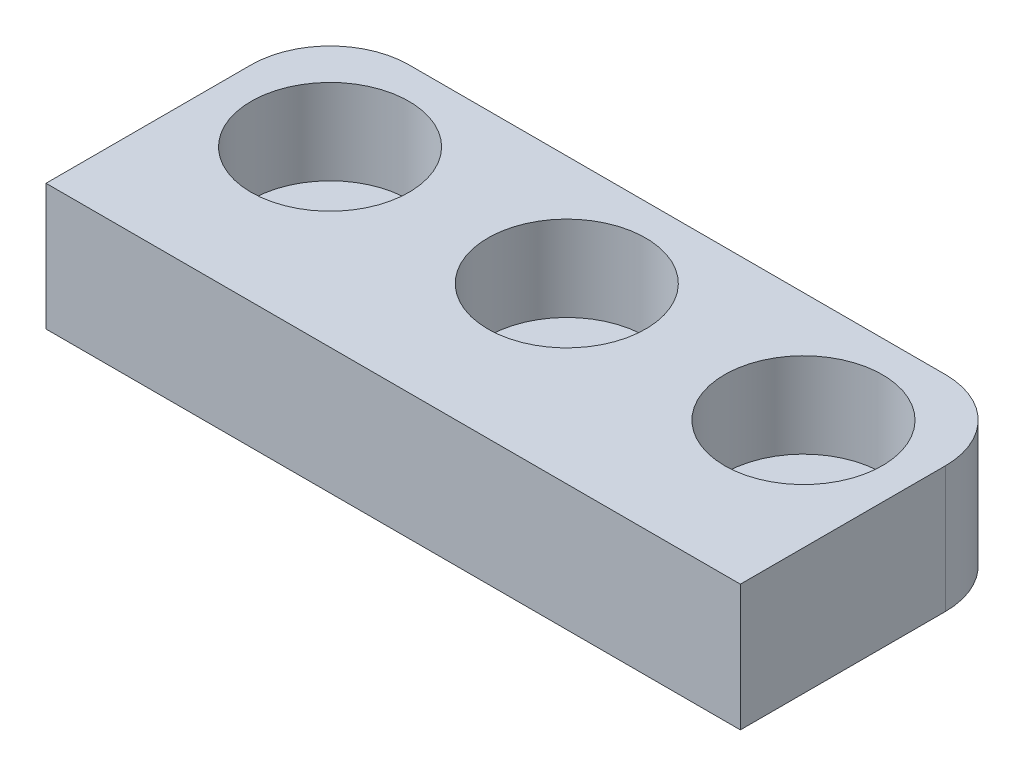
ISO-10303-21;
HEADER;
FILE_DESCRIPTION(('STEP AP214'),'2;1');
FILE_NAME('part.step','',(''),(''),'','','');
FILE_SCHEMA(('AUTOMOTIVE_DESIGN { 1 0 10303 214 1 1 1 1 }'));
ENDSEC;
DATA;
#1=APPLICATION_CONTEXT('core data for automotive mechanical design processes');
#2=APPLICATION_PROTOCOL_DEFINITION('international standard','automotive_design',2000,#1);
#3=PRODUCT_CONTEXT('',#1,'mechanical');
#4=PRODUCT('Part','Part','',(#3));
#5=PRODUCT_RELATED_PRODUCT_CATEGORY('part','',(#4));
#6=PRODUCT_DEFINITION_FORMATION('','',#4);
#7=PRODUCT_DEFINITION_CONTEXT('part definition',#1,'design');
#8=PRODUCT_DEFINITION('design','',#6,#7);
#9=PRODUCT_DEFINITION_SHAPE('','',#8);
#10=(LENGTH_UNIT() NAMED_UNIT(*) SI_UNIT(.MILLI.,.METRE.));
#11=(NAMED_UNIT(*) PLANE_ANGLE_UNIT() SI_UNIT($,.RADIAN.));
#12=(NAMED_UNIT(*) SI_UNIT($,.STERADIAN.) SOLID_ANGLE_UNIT());
#13=UNCERTAINTY_MEASURE_WITH_UNIT(LENGTH_MEASURE(1.E-05),#10,'distance_accuracy_value','');
#14=(GEOMETRIC_REPRESENTATION_CONTEXT(3) GLOBAL_UNCERTAINTY_ASSIGNED_CONTEXT((#13)) GLOBAL_UNIT_ASSIGNED_CONTEXT((#10,
#11,#12)) REPRESENTATION_CONTEXT('',''));
#15=CARTESIAN_POINT('',(0.,0.,0.));
#16=DIRECTION('',(0.,0.,1.));
#17=DIRECTION('',(1.,0.,0.));
#18=AXIS2_PLACEMENT_3D('',#15,#16,#17);
#19=CARTESIAN_POINT('',(22.,-8.,9.));
#20=DIRECTION('',(1.,0.,0.));
#21=DIRECTION('',(0.,0.,-1.));
#22=AXIS2_PLACEMENT_3D('',#19,#20,#21);
#23=PLANE('',#22);
#24=DIRECTION('',(0.,0.,-1.));
#25=VECTOR('',#24,1.);
#26=CARTESIAN_POINT('',(22.,-8.,9.));
#27=LINE('',#26,#25);
#28=CARTESIAN_POINT('',(22.,-8.,9.));
#29=VERTEX_POINT('',#28);
#30=CARTESIAN_POINT('',(22.,-8.,-4.));
#31=VERTEX_POINT('',#30);
#32=EDGE_CURVE('E110',#29,#31,#27,.T.);
#33=ORIENTED_EDGE('',*,*,#32,.T.);
#34=DIRECTION('',(0.,1.,0.));
#35=VECTOR('',#34,1.);
#36=CARTESIAN_POINT('',(22.,-8.,-4.));
#37=LINE('',#36,#35);
#38=CARTESIAN_POINT('',(22.,0.,-4.));
#39=VERTEX_POINT('',#38);
#40=EDGE_CURVE('E124',#31,#39,#37,.T.);
#41=ORIENTED_EDGE('',*,*,#40,.T.);
#42=DIRECTION('',(0.,0.,-1.));
#43=VECTOR('',#42,1.);
#44=CARTESIAN_POINT('',(22.,0.,9.));
#45=LINE('',#44,#43);
#46=CARTESIAN_POINT('',(22.,0.,9.));
#47=VERTEX_POINT('',#46);
#48=EDGE_CURVE('E114',#47,#39,#45,.T.);
#49=ORIENTED_EDGE('',*,*,#48,.F.);
#50=DIRECTION('',(0.,1.,0.));
#51=VECTOR('',#50,1.);
#52=CARTESIAN_POINT('',(22.,-8.,9.));
#53=LINE('',#52,#51);
#54=EDGE_CURVE('E105',#29,#47,#53,.T.);
#55=ORIENTED_EDGE('',*,*,#54,.F.);
#56=EDGE_LOOP('',(#33,#41,#49,#55));
#57=FACE_BOUND('',#56,.T.);
#58=ADVANCED_FACE('F40',(#57),#23,.T.);
#59=CARTESIAN_POINT('',(-22.,-8.,9.));
#60=DIRECTION('',(0.,0.,1.));
#61=DIRECTION('',(1.,0.,0.));
#62=AXIS2_PLACEMENT_3D('',#59,#60,#61);
#63=PLANE('',#62);
#64=DIRECTION('',(1.,0.,0.));
#65=VECTOR('',#64,1.);
#66=CARTESIAN_POINT('',(-22.,0.,9.));
#67=LINE('',#66,#65);
#68=CARTESIAN_POINT('',(-22.,0.,9.));
#69=VERTEX_POINT('',#68);
#70=EDGE_CURVE('E104',#69,#47,#67,.T.);
#71=ORIENTED_EDGE('',*,*,#70,.F.);
#72=DIRECTION('',(0.,1.,0.));
#73=VECTOR('',#72,1.);
#74=CARTESIAN_POINT('',(-22.,-8.,9.));
#75=LINE('',#74,#73);
#76=CARTESIAN_POINT('',(-22.,-8.,9.));
#77=VERTEX_POINT('',#76);
#78=EDGE_CURVE('E94',#77,#69,#75,.T.);
#79=ORIENTED_EDGE('',*,*,#78,.F.);
#80=DIRECTION('',(1.,0.,0.));
#81=VECTOR('',#80,1.);
#82=CARTESIAN_POINT('',(-22.,-8.,9.));
#83=LINE('',#82,#81);
#84=EDGE_CURVE('E97',#77,#29,#83,.T.);
#85=ORIENTED_EDGE('',*,*,#84,.T.);
#86=ORIENTED_EDGE('',*,*,#54,.T.);
#87=EDGE_LOOP('',(#71,#79,#85,#86));
#88=FACE_BOUND('',#87,.T.);
#89=ADVANCED_FACE('F102',(#88),#63,.T.);
#90=CARTESIAN_POINT('',(-22.,-8.,9.));
#91=DIRECTION('',(-1.,0.,0.));
#92=DIRECTION('',(0.,0.,1.));
#93=AXIS2_PLACEMENT_3D('',#90,#91,#92);
#94=PLANE('',#93);
#95=DIRECTION('',(0.,0.,1.));
#96=VECTOR('',#95,1.);
#97=CARTESIAN_POINT('',(-22.,0.,9.));
#98=LINE('',#97,#96);
#99=CARTESIAN_POINT('',(-22.,0.,-4.));
#100=VERTEX_POINT('',#99);
#101=EDGE_CURVE('E121',#100,#69,#98,.T.);
#102=ORIENTED_EDGE('',*,*,#101,.F.);
#103=DIRECTION('',(0.,1.,0.));
#104=VECTOR('',#103,1.);
#105=CARTESIAN_POINT('',(-22.,-8.,-4.));
#106=LINE('',#105,#104);
#107=CARTESIAN_POINT('',(-22.,-8.,-4.));
#108=VERTEX_POINT('',#107);
#109=EDGE_CURVE('E11',#100,#108,#106,.F.);
#110=ORIENTED_EDGE('',*,*,#109,.T.);
#111=DIRECTION('',(0.,0.,1.));
#112=VECTOR('',#111,1.);
#113=CARTESIAN_POINT('',(-22.,-8.,9.));
#114=LINE('',#113,#112);
#115=EDGE_CURVE('E91',#108,#77,#114,.T.);
#116=ORIENTED_EDGE('',*,*,#115,.T.);
#117=ORIENTED_EDGE('',*,*,#78,.T.);
#118=EDGE_LOOP('',(#102,#110,#116,#117));
#119=FACE_BOUND('',#118,.T.);
#120=ADVANCED_FACE('F93',(#119),#94,.T.);
#121=CARTESIAN_POINT('',(-22.,-8.,-9.));
#122=DIRECTION('',(0.,0.,-1.));
#123=DIRECTION('',(-1.,0.,0.));
#124=AXIS2_PLACEMENT_3D('',#121,#122,#123);
#125=PLANE('',#124);
#126=DIRECTION('',(-1.,0.,0.));
#127=VECTOR('',#126,1.);
#128=CARTESIAN_POINT('',(-22.,0.,-9.));
#129=LINE('',#128,#127);
#130=CARTESIAN_POINT('',(17.,0.,-9.));
#131=VERTEX_POINT('',#130);
#132=CARTESIAN_POINT('',(-17.,0.,-9.));
#133=VERTEX_POINT('',#132);
#134=EDGE_CURVE('E117',#131,#133,#129,.T.);
#135=ORIENTED_EDGE('',*,*,#134,.F.);
#136=DIRECTION('',(0.,1.,0.));
#137=VECTOR('',#136,1.);
#138=CARTESIAN_POINT('',(17.,-8.,-9.));
#139=LINE('',#138,#137);
#140=CARTESIAN_POINT('',(17.,-8.,-9.));
#141=VERTEX_POINT('',#140);
#142=EDGE_CURVE('E135',#131,#141,#139,.F.);
#143=ORIENTED_EDGE('',*,*,#142,.T.);
#144=DIRECTION('',(-1.,0.,0.));
#145=VECTOR('',#144,1.);
#146=CARTESIAN_POINT('',(-22.,-8.,-9.));
#147=LINE('',#146,#145);
#148=CARTESIAN_POINT('',(-17.,-8.,-9.));
#149=VERTEX_POINT('',#148);
#150=EDGE_CURVE('E98',#141,#149,#147,.T.);
#151=ORIENTED_EDGE('',*,*,#150,.T.);
#152=DIRECTION('',(0.,1.,0.));
#153=VECTOR('',#152,1.);
#154=CARTESIAN_POINT('',(-17.,-8.,-9.));
#155=LINE('',#154,#153);
#156=EDGE_CURVE('E132',#149,#133,#155,.T.);
#157=ORIENTED_EDGE('',*,*,#156,.T.);
#158=EDGE_LOOP('',(#135,#143,#151,#157));
#159=FACE_BOUND('',#158,.T.);
#160=ADVANCED_FACE('F149',(#159),#125,.T.);
#161=CARTESIAN_POINT('',(0.,-8.,0.));
#162=DIRECTION('',(0.,-1.,0.));
#163=DIRECTION('',(0.,0.,-1.));
#164=AXIS2_PLACEMENT_3D('',#161,#162,#163);
#165=PLANE('',#164);
#166=CARTESIAN_POINT('',(-15.,-8.,-2.));
#167=DIRECTION('',(0.,1.,0.));
#168=DIRECTION('',(0.,0.,1.));
#169=AXIS2_PLACEMENT_3D('',#166,#167,#168);
#170=CIRCLE('',#169,2.65);
#171=CARTESIAN_POINT('',(-15.,-8.,0.65));
#172=VERTEX_POINT('',#171);
#173=EDGE_CURVE('E223',#172,#172,#170,.T.);
#174=ORIENTED_EDGE('',*,*,#173,.T.);
#175=EDGE_LOOP('',(#174));
#176=FACE_BOUND('',#175,.T.);
#177=CARTESIAN_POINT('',(0.,-8.,-2.));
#178=DIRECTION('',(0.,1.,0.));
#179=DIRECTION('',(0.,0.,1.));
#180=AXIS2_PLACEMENT_3D('',#177,#178,#179);
#181=CIRCLE('',#180,2.65);
#182=CARTESIAN_POINT('',(0.,-8.,0.65));
#183=VERTEX_POINT('',#182);
#184=EDGE_CURVE('E235',#183,#183,#181,.T.);
#185=ORIENTED_EDGE('',*,*,#184,.T.);
#186=EDGE_LOOP('',(#185));
#187=FACE_BOUND('',#186,.T.);
#188=CARTESIAN_POINT('',(15.,-8.,-2.));
#189=DIRECTION('',(0.,1.,0.));
#190=DIRECTION('',(0.,0.,1.));
#191=AXIS2_PLACEMENT_3D('',#188,#189,#190);
#192=CIRCLE('',#191,2.65);
#193=CARTESIAN_POINT('',(15.,-8.,0.649999999999997));
#194=VERTEX_POINT('',#193);
#195=EDGE_CURVE('E118',#194,#194,#192,.T.);
#196=ORIENTED_EDGE('',*,*,#195,.T.);
#197=EDGE_LOOP('',(#196));
#198=FACE_BOUND('',#197,.T.);
#199=ORIENTED_EDGE('',*,*,#150,.F.);
#200=CARTESIAN_POINT('',(17.,-8.,-4.));
#201=DIRECTION('',(0.,-1.,0.));
#202=DIRECTION('',(0.,0.,-1.));
#203=AXIS2_PLACEMENT_3D('',#200,#201,#202);
#204=CIRCLE('',#203,5.);
#205=EDGE_CURVE('E48',#141,#31,#204,.T.);
#206=ORIENTED_EDGE('',*,*,#205,.T.);
#207=ORIENTED_EDGE('',*,*,#32,.F.);
#208=ORIENTED_EDGE('',*,*,#84,.F.);
#209=ORIENTED_EDGE('',*,*,#115,.F.);
#210=CARTESIAN_POINT('',(-17.,-8.,-4.));
#211=DIRECTION('',(0.,-1.,0.));
#212=DIRECTION('',(0.,0.,-1.));
#213=AXIS2_PLACEMENT_3D('',#210,#211,#212);
#214=CIRCLE('',#213,5.);
#215=EDGE_CURVE('E60',#108,#149,#214,.T.);
#216=ORIENTED_EDGE('',*,*,#215,.T.);
#217=EDGE_LOOP('',(#199,#206,#207,#208,#209,#216));
#218=FACE_BOUND('',#217,.T.);
#219=ADVANCED_FACE('F108',(#176,#187,#198,#218),#165,.T.);
#220=CARTESIAN_POINT('',(0.,0.,0.));
#221=DIRECTION('',(0.,-1.,0.));
#222=DIRECTION('',(0.,0.,-1.));
#223=AXIS2_PLACEMENT_3D('',#220,#221,#222);
#224=PLANE('',#223);
#225=CARTESIAN_POINT('',(-15.,0.,-2.));
#226=DIRECTION('',(0.,1.,0.));
#227=DIRECTION('',(0.,0.,1.));
#228=AXIS2_PLACEMENT_3D('',#225,#226,#227);
#229=CIRCLE('',#228,5.);
#230=CARTESIAN_POINT('',(-15.,0.,3.));
#231=VERTEX_POINT('',#230);
#232=EDGE_CURVE('E216',#231,#231,#229,.T.);
#233=ORIENTED_EDGE('',*,*,#232,.F.);
#234=EDGE_LOOP('',(#233));
#235=FACE_BOUND('',#234,.T.);
#236=CARTESIAN_POINT('',(0.,0.,-2.));
#237=DIRECTION('',(0.,1.,0.));
#238=DIRECTION('',(0.,0.,1.));
#239=AXIS2_PLACEMENT_3D('',#236,#237,#238);
#240=CIRCLE('',#239,5.);
#241=CARTESIAN_POINT('',(0.,0.,3.));
#242=VERTEX_POINT('',#241);
#243=EDGE_CURVE('E226',#242,#242,#240,.T.);
#244=ORIENTED_EDGE('',*,*,#243,.F.);
#245=EDGE_LOOP('',(#244));
#246=FACE_BOUND('',#245,.T.);
#247=CARTESIAN_POINT('',(15.,0.,-2.));
#248=DIRECTION('',(0.,1.,0.));
#249=DIRECTION('',(0.,0.,1.));
#250=AXIS2_PLACEMENT_3D('',#247,#248,#249);
#251=CIRCLE('',#250,5.);
#252=CARTESIAN_POINT('',(15.,0.,3.));
#253=VERTEX_POINT('',#252);
#254=EDGE_CURVE('E238',#253,#253,#251,.T.);
#255=ORIENTED_EDGE('',*,*,#254,.F.);
#256=EDGE_LOOP('',(#255));
#257=FACE_BOUND('',#256,.T.);
#258=ORIENTED_EDGE('',*,*,#48,.T.);
#259=CARTESIAN_POINT('',(17.,0.,-4.));
#260=DIRECTION('',(0.,-1.,0.));
#261=DIRECTION('',(0.,0.,-1.));
#262=AXIS2_PLACEMENT_3D('',#259,#260,#261);
#263=CIRCLE('',#262,5.);
#264=EDGE_CURVE('E130',#39,#131,#263,.F.);
#265=ORIENTED_EDGE('',*,*,#264,.T.);
#266=ORIENTED_EDGE('',*,*,#134,.T.);
#267=CARTESIAN_POINT('',(-17.,0.,-4.));
#268=DIRECTION('',(0.,-1.,0.));
#269=DIRECTION('',(0.,0.,-1.));
#270=AXIS2_PLACEMENT_3D('',#267,#268,#269);
#271=CIRCLE('',#270,5.);
#272=EDGE_CURVE('E128',#133,#100,#271,.F.);
#273=ORIENTED_EDGE('',*,*,#272,.T.);
#274=ORIENTED_EDGE('',*,*,#101,.T.);
#275=ORIENTED_EDGE('',*,*,#70,.T.);
#276=EDGE_LOOP('',(#258,#265,#266,#273,#274,#275));
#277=FACE_BOUND('',#276,.T.);
#278=ADVANCED_FACE('F147',(#235,#246,#257,#277),#224,.F.);
#279=CARTESIAN_POINT('',(15.,0.,-2.));
#280=DIRECTION('',(0.,1.,0.));
#281=DIRECTION('',(0.,0.,1.));
#282=AXIS2_PLACEMENT_3D('',#279,#280,#281);
#283=CYLINDRICAL_SURFACE('',#282,2.65);
#284=ORIENTED_EDGE('',*,*,#195,.F.);
#285=EDGE_LOOP('',(#284));
#286=FACE_BOUND('',#285,.T.);
#287=CARTESIAN_POINT('',(15.,-5.4,-2.));
#288=DIRECTION('',(0.,1.,0.));
#289=DIRECTION('',(0.,0.,1.));
#290=AXIS2_PLACEMENT_3D('',#287,#288,#289);
#291=CIRCLE('',#290,2.65);
#292=CARTESIAN_POINT('',(15.,-5.4,0.649999999999997));
#293=VERTEX_POINT('',#292);
#294=EDGE_CURVE('E244',#293,#293,#291,.T.);
#295=ORIENTED_EDGE('',*,*,#294,.T.);
#296=EDGE_LOOP('',(#295));
#297=FACE_BOUND('',#296,.T.);
#298=ADVANCED_FACE('F171',(#286,#297),#283,.F.);
#299=CARTESIAN_POINT('',(17.65,-5.4,-2.));
#300=DIRECTION('',(0.,-1.,0.));
#301=DIRECTION('',(0.,0.,-1.));
#302=AXIS2_PLACEMENT_3D('',#299,#300,#301);
#303=PLANE('',#302);
#304=ORIENTED_EDGE('',*,*,#294,.F.);
#305=EDGE_LOOP('',(#304));
#306=FACE_BOUND('',#305,.T.);
#307=CARTESIAN_POINT('',(15.,-5.4,-2.));
#308=DIRECTION('',(0.,1.,0.));
#309=DIRECTION('',(0.,0.,1.));
#310=AXIS2_PLACEMENT_3D('',#307,#308,#309);
#311=CIRCLE('',#310,5.);
#312=CARTESIAN_POINT('',(15.,-5.4,2.99999999999999));
#313=VERTEX_POINT('',#312);
#314=EDGE_CURVE('E241',#313,#313,#311,.T.);
#315=ORIENTED_EDGE('',*,*,#314,.T.);
#316=EDGE_LOOP('',(#315));
#317=FACE_BOUND('',#316,.T.);
#318=ADVANCED_FACE('F178',(#306,#317),#303,.F.);
#319=CARTESIAN_POINT('',(15.,0.,-2.));
#320=DIRECTION('',(0.,1.,0.));
#321=DIRECTION('',(0.,0.,1.));
#322=AXIS2_PLACEMENT_3D('',#319,#320,#321);
#323=CYLINDRICAL_SURFACE('',#322,5.);
#324=ORIENTED_EDGE('',*,*,#314,.F.);
#325=EDGE_LOOP('',(#324));
#326=FACE_BOUND('',#325,.T.);
#327=ORIENTED_EDGE('',*,*,#254,.T.);
#328=EDGE_LOOP('',(#327));
#329=FACE_BOUND('',#328,.T.);
#330=ADVANCED_FACE('F182',(#326,#329),#323,.F.);
#331=CARTESIAN_POINT('',(0.,0.,-2.));
#332=DIRECTION('',(0.,1.,0.));
#333=DIRECTION('',(0.,0.,1.));
#334=AXIS2_PLACEMENT_3D('',#331,#332,#333);
#335=CYLINDRICAL_SURFACE('',#334,2.65);
#336=ORIENTED_EDGE('',*,*,#184,.F.);
#337=EDGE_LOOP('',(#336));
#338=FACE_BOUND('',#337,.T.);
#339=CARTESIAN_POINT('',(0.,-5.4,-2.));
#340=DIRECTION('',(0.,1.,0.));
#341=DIRECTION('',(0.,0.,1.));
#342=AXIS2_PLACEMENT_3D('',#339,#340,#341);
#343=CIRCLE('',#342,2.65);
#344=CARTESIAN_POINT('',(0.,-5.4,0.650000000000001));
#345=VERTEX_POINT('',#344);
#346=EDGE_CURVE('E232',#345,#345,#343,.T.);
#347=ORIENTED_EDGE('',*,*,#346,.T.);
#348=EDGE_LOOP('',(#347));
#349=FACE_BOUND('',#348,.T.);
#350=ADVANCED_FACE('F186',(#338,#349),#335,.F.);
#351=CARTESIAN_POINT('',(2.65,-5.4,-2.));
#352=DIRECTION('',(0.,-1.,0.));
#353=DIRECTION('',(0.,0.,-1.));
#354=AXIS2_PLACEMENT_3D('',#351,#352,#353);
#355=PLANE('',#354);
#356=ORIENTED_EDGE('',*,*,#346,.F.);
#357=EDGE_LOOP('',(#356));
#358=FACE_BOUND('',#357,.T.);
#359=CARTESIAN_POINT('',(0.,-5.4,-2.));
#360=DIRECTION('',(0.,1.,0.));
#361=DIRECTION('',(0.,0.,1.));
#362=AXIS2_PLACEMENT_3D('',#359,#360,#361);
#363=CIRCLE('',#362,5.);
#364=CARTESIAN_POINT('',(0.,-5.4,3.));
#365=VERTEX_POINT('',#364);
#366=EDGE_CURVE('E229',#365,#365,#363,.T.);
#367=ORIENTED_EDGE('',*,*,#366,.T.);
#368=EDGE_LOOP('',(#367));
#369=FACE_BOUND('',#368,.T.);
#370=ADVANCED_FACE('F190',(#358,#369),#355,.F.);
#371=CARTESIAN_POINT('',(0.,0.,-2.));
#372=DIRECTION('',(0.,1.,0.));
#373=DIRECTION('',(0.,0.,1.));
#374=AXIS2_PLACEMENT_3D('',#371,#372,#373);
#375=CYLINDRICAL_SURFACE('',#374,5.);
#376=ORIENTED_EDGE('',*,*,#366,.F.);
#377=EDGE_LOOP('',(#376));
#378=FACE_BOUND('',#377,.T.);
#379=ORIENTED_EDGE('',*,*,#243,.T.);
#380=EDGE_LOOP('',(#379));
#381=FACE_BOUND('',#380,.T.);
#382=ADVANCED_FACE('F194',(#378,#381),#375,.F.);
#383=CARTESIAN_POINT('',(-15.,0.,-2.));
#384=DIRECTION('',(0.,1.,0.));
#385=DIRECTION('',(0.,0.,1.));
#386=AXIS2_PLACEMENT_3D('',#383,#384,#385);
#387=CYLINDRICAL_SURFACE('',#386,2.65);
#388=ORIENTED_EDGE('',*,*,#173,.F.);
#389=EDGE_LOOP('',(#388));
#390=FACE_BOUND('',#389,.T.);
#391=CARTESIAN_POINT('',(-15.,-5.4,-2.));
#392=DIRECTION('',(0.,1.,0.));
#393=DIRECTION('',(0.,0.,1.));
#394=AXIS2_PLACEMENT_3D('',#391,#392,#393);
#395=CIRCLE('',#394,2.65);
#396=CARTESIAN_POINT('',(-15.,-5.4,0.65));
#397=VERTEX_POINT('',#396);
#398=EDGE_CURVE('E218',#397,#397,#395,.T.);
#399=ORIENTED_EDGE('',*,*,#398,.T.);
#400=EDGE_LOOP('',(#399));
#401=FACE_BOUND('',#400,.T.);
#402=ADVANCED_FACE('F198',(#390,#401),#387,.F.);
#403=CARTESIAN_POINT('',(-12.35,-5.4,-2.));
#404=DIRECTION('',(0.,-1.,0.));
#405=DIRECTION('',(0.,0.,-1.));
#406=AXIS2_PLACEMENT_3D('',#403,#404,#405);
#407=PLANE('',#406);
#408=ORIENTED_EDGE('',*,*,#398,.F.);
#409=EDGE_LOOP('',(#408));
#410=FACE_BOUND('',#409,.T.);
#411=CARTESIAN_POINT('',(-15.,-5.4,-2.));
#412=DIRECTION('',(0.,1.,0.));
#413=DIRECTION('',(0.,0.,1.));
#414=AXIS2_PLACEMENT_3D('',#411,#412,#413);
#415=CIRCLE('',#414,5.);
#416=CARTESIAN_POINT('',(-15.,-5.4,3.));
#417=VERTEX_POINT('',#416);
#418=EDGE_CURVE('E213',#417,#417,#415,.T.);
#419=ORIENTED_EDGE('',*,*,#418,.T.);
#420=EDGE_LOOP('',(#419));
#421=FACE_BOUND('',#420,.T.);
#422=ADVANCED_FACE('F202',(#410,#421),#407,.F.);
#423=CARTESIAN_POINT('',(-15.,0.,-2.));
#424=DIRECTION('',(0.,1.,0.));
#425=DIRECTION('',(0.,0.,1.));
#426=AXIS2_PLACEMENT_3D('',#423,#424,#425);
#427=CYLINDRICAL_SURFACE('',#426,5.);
#428=ORIENTED_EDGE('',*,*,#418,.F.);
#429=EDGE_LOOP('',(#428));
#430=FACE_BOUND('',#429,.T.);
#431=ORIENTED_EDGE('',*,*,#232,.T.);
#432=EDGE_LOOP('',(#431));
#433=FACE_BOUND('',#432,.T.);
#434=ADVANCED_FACE('F156',(#430,#433),#427,.F.);
#435=CARTESIAN_POINT('',(17.,-8.,-4.));
#436=DIRECTION('',(0.,1.,0.));
#437=DIRECTION('',(0.,0.,1.));
#438=AXIS2_PLACEMENT_3D('',#435,#436,#437);
#439=CYLINDRICAL_SURFACE('',#438,5.);
#440=ORIENTED_EDGE('',*,*,#205,.F.);
#441=ORIENTED_EDGE('',*,*,#142,.F.);
#442=ORIENTED_EDGE('',*,*,#264,.F.);
#443=ORIENTED_EDGE('',*,*,#40,.F.);
#444=EDGE_LOOP('',(#440,#441,#442,#443));
#445=FACE_BOUND('',#444,.T.);
#446=ADVANCED_FACE('F144',(#445),#439,.T.);
#447=CARTESIAN_POINT('',(-17.,-8.,-4.));
#448=DIRECTION('',(0.,1.,0.));
#449=DIRECTION('',(0.,0.,1.));
#450=AXIS2_PLACEMENT_3D('',#447,#448,#449);
#451=CYLINDRICAL_SURFACE('',#450,5.);
#452=ORIENTED_EDGE('',*,*,#215,.F.);
#453=ORIENTED_EDGE('',*,*,#109,.F.);
#454=ORIENTED_EDGE('',*,*,#272,.F.);
#455=ORIENTED_EDGE('',*,*,#156,.F.);
#456=EDGE_LOOP('',(#452,#453,#454,#455));
#457=FACE_BOUND('',#456,.T.);
#458=ADVANCED_FACE('F42',(#457),#451,.T.);
#459=CLOSED_SHELL('',(#58,#89,#120,#160,#219,#278,#298,#318,#330,#350,#370,#382,#402,#422,#434,
#446,#458));
#460=MANIFOLD_SOLID_BREP('B2',#459);
#461=ADVANCED_BREP_SHAPE_REPRESENTATION('',(#18,#460),#14);
#462=SHAPE_DEFINITION_REPRESENTATION(#9,#461);
ENDSEC;
END-ISO-10303-21;
